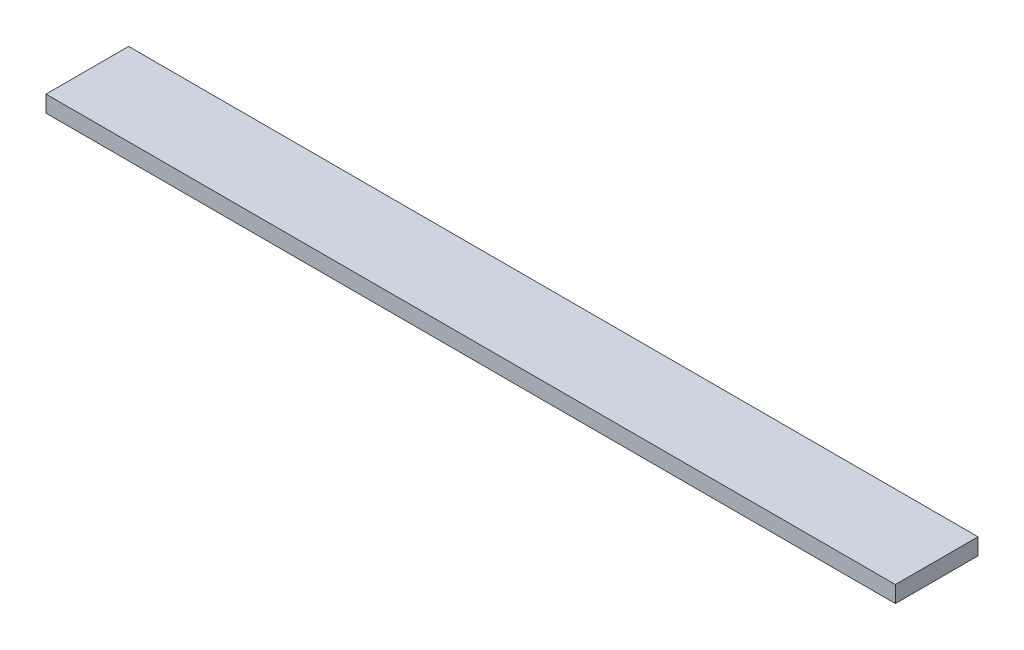
ISO-10303-21;
HEADER;
FILE_DESCRIPTION(('STEP AP214'),'2;1');
FILE_NAME('part.step','',(''),(''),'','','');
FILE_SCHEMA(('AUTOMOTIVE_DESIGN { 1 0 10303 214 1 1 1 1 }'));
ENDSEC;
DATA;
#1=APPLICATION_CONTEXT('core data for automotive mechanical design processes');
#2=APPLICATION_PROTOCOL_DEFINITION('international standard','automotive_design',2000,#1);
#3=PRODUCT_CONTEXT('',#1,'mechanical');
#4=PRODUCT('Part','Part','',(#3));
#5=PRODUCT_RELATED_PRODUCT_CATEGORY('part','',(#4));
#6=PRODUCT_DEFINITION_FORMATION('','',#4);
#7=PRODUCT_DEFINITION_CONTEXT('part definition',#1,'design');
#8=PRODUCT_DEFINITION('design','',#6,#7);
#9=PRODUCT_DEFINITION_SHAPE('','',#8);
#10=(LENGTH_UNIT() NAMED_UNIT(*) SI_UNIT(.MILLI.,.METRE.));
#11=(NAMED_UNIT(*) PLANE_ANGLE_UNIT() SI_UNIT($,.RADIAN.));
#12=(NAMED_UNIT(*) SI_UNIT($,.STERADIAN.) SOLID_ANGLE_UNIT());
#13=UNCERTAINTY_MEASURE_WITH_UNIT(LENGTH_MEASURE(1.E-05),#10,'distance_accuracy_value','');
#14=(GEOMETRIC_REPRESENTATION_CONTEXT(3) GLOBAL_UNCERTAINTY_ASSIGNED_CONTEXT((#13)) GLOBAL_UNIT_ASSIGNED_CONTEXT((#10,
#11,#12)) REPRESENTATION_CONTEXT('',''));
#15=CARTESIAN_POINT('',(0.,0.,0.));
#16=DIRECTION('',(0.,0.,1.));
#17=DIRECTION('',(1.,0.,0.));
#18=AXIS2_PLACEMENT_3D('',#15,#16,#17);
#19=CARTESIAN_POINT('',(-128.5,5.,12.5));
#20=DIRECTION('',(1.,0.,0.));
#21=DIRECTION('',(0.,0.,-1.));
#22=AXIS2_PLACEMENT_3D('',#19,#20,#21);
#23=PLANE('',#22);
#24=DIRECTION('',(0.,0.,1.));
#25=VECTOR('',#24,1.);
#26=CARTESIAN_POINT('',(-128.5,0.,12.5));
#27=LINE('',#26,#25);
#28=CARTESIAN_POINT('',(-128.5,0.,-12.5));
#29=VERTEX_POINT('',#28);
#30=CARTESIAN_POINT('',(-128.5,0.,12.5));
#31=VERTEX_POINT('',#30);
#32=EDGE_CURVE('E99',#29,#31,#27,.T.);
#33=ORIENTED_EDGE('',*,*,#32,.T.);
#34=DIRECTION('',(0.,-1.,0.));
#35=VECTOR('',#34,1.);
#36=CARTESIAN_POINT('',(-128.5,5.,12.5));
#37=LINE('',#36,#35);
#38=CARTESIAN_POINT('',(-128.5,5.,12.5));
#39=VERTEX_POINT('',#38);
#40=EDGE_CURVE('E11',#39,#31,#37,.T.);
#41=ORIENTED_EDGE('',*,*,#40,.F.);
#42=DIRECTION('',(0.,0.,1.));
#43=VECTOR('',#42,1.);
#44=CARTESIAN_POINT('',(-128.5,5.,12.5));
#45=LINE('',#44,#43);
#46=CARTESIAN_POINT('',(-128.5,5.,-12.5));
#47=VERTEX_POINT('',#46);
#48=EDGE_CURVE('E87',#47,#39,#45,.T.);
#49=ORIENTED_EDGE('',*,*,#48,.F.);
#50=DIRECTION('',(0.,-1.,0.));
#51=VECTOR('',#50,1.);
#52=CARTESIAN_POINT('',(-128.5,5.,-12.5));
#53=LINE('',#52,#51);
#54=EDGE_CURVE('E95',#47,#29,#53,.T.);
#55=ORIENTED_EDGE('',*,*,#54,.T.);
#56=EDGE_LOOP('',(#33,#41,#49,#55));
#57=FACE_BOUND('',#56,.T.);
#58=ADVANCED_FACE('F36',(#57),#23,.F.);
#59=CARTESIAN_POINT('',(128.5,5.,12.5));
#60=DIRECTION('',(0.,0.,-1.));
#61=DIRECTION('',(-1.,0.,0.));
#62=AXIS2_PLACEMENT_3D('',#59,#60,#61);
#63=PLANE('',#62);
#64=DIRECTION('',(1.,0.,0.));
#65=VECTOR('',#64,1.);
#66=CARTESIAN_POINT('',(128.5,0.,12.5));
#67=LINE('',#66,#65);
#68=CARTESIAN_POINT('',(128.5,0.,12.5));
#69=VERTEX_POINT('',#68);
#70=EDGE_CURVE('E91',#31,#69,#67,.T.);
#71=ORIENTED_EDGE('',*,*,#70,.T.);
#72=DIRECTION('',(0.,-1.,0.));
#73=VECTOR('',#72,1.);
#74=CARTESIAN_POINT('',(128.5,5.,12.5));
#75=LINE('',#74,#73);
#76=CARTESIAN_POINT('',(128.5,5.,12.5));
#77=VERTEX_POINT('',#76);
#78=EDGE_CURVE('E44',#77,#69,#75,.T.);
#79=ORIENTED_EDGE('',*,*,#78,.F.);
#80=DIRECTION('',(1.,0.,0.));
#81=VECTOR('',#80,1.);
#82=CARTESIAN_POINT('',(128.5,5.,12.5));
#83=LINE('',#82,#81);
#84=EDGE_CURVE('E82',#39,#77,#83,.T.);
#85=ORIENTED_EDGE('',*,*,#84,.F.);
#86=ORIENTED_EDGE('',*,*,#40,.T.);
#87=EDGE_LOOP('',(#71,#79,#85,#86));
#88=FACE_BOUND('',#87,.T.);
#89=ADVANCED_FACE('F90',(#88),#63,.F.);
#90=CARTESIAN_POINT('',(128.5,5.,12.5));
#91=DIRECTION('',(-1.,0.,0.));
#92=DIRECTION('',(0.,0.,1.));
#93=AXIS2_PLACEMENT_3D('',#90,#91,#92);
#94=PLANE('',#93);
#95=DIRECTION('',(0.,0.,-1.));
#96=VECTOR('',#95,1.);
#97=CARTESIAN_POINT('',(128.5,0.,12.5));
#98=LINE('',#97,#96);
#99=CARTESIAN_POINT('',(128.5,0.,-12.5));
#100=VERTEX_POINT('',#99);
#101=EDGE_CURVE('E69',#69,#100,#98,.T.);
#102=ORIENTED_EDGE('',*,*,#101,.T.);
#103=DIRECTION('',(0.,-1.,0.));
#104=VECTOR('',#103,1.);
#105=CARTESIAN_POINT('',(128.5,5.,-12.5));
#106=LINE('',#105,#104);
#107=CARTESIAN_POINT('',(128.5,5.,-12.5));
#108=VERTEX_POINT('',#107);
#109=EDGE_CURVE('E92',#108,#100,#106,.T.);
#110=ORIENTED_EDGE('',*,*,#109,.F.);
#111=DIRECTION('',(0.,0.,-1.));
#112=VECTOR('',#111,1.);
#113=CARTESIAN_POINT('',(128.5,5.,12.5));
#114=LINE('',#113,#112);
#115=EDGE_CURVE('E85',#77,#108,#114,.T.);
#116=ORIENTED_EDGE('',*,*,#115,.F.);
#117=ORIENTED_EDGE('',*,*,#78,.T.);
#118=EDGE_LOOP('',(#102,#110,#116,#117));
#119=FACE_BOUND('',#118,.T.);
#120=ADVANCED_FACE('F93',(#119),#94,.F.);
#121=CARTESIAN_POINT('',(128.5,5.,-12.5));
#122=DIRECTION('',(0.,0.,1.));
#123=DIRECTION('',(1.,0.,0.));
#124=AXIS2_PLACEMENT_3D('',#121,#122,#123);
#125=PLANE('',#124);
#126=DIRECTION('',(-1.,0.,0.));
#127=VECTOR('',#126,1.);
#128=CARTESIAN_POINT('',(128.5,0.,-12.5));
#129=LINE('',#128,#127);
#130=EDGE_CURVE('E75',#100,#29,#129,.T.);
#131=ORIENTED_EDGE('',*,*,#130,.T.);
#132=ORIENTED_EDGE('',*,*,#54,.F.);
#133=DIRECTION('',(-1.,0.,0.));
#134=VECTOR('',#133,1.);
#135=CARTESIAN_POINT('',(128.5,5.,-12.5));
#136=LINE('',#135,#134);
#137=EDGE_CURVE('E52',#108,#47,#136,.T.);
#138=ORIENTED_EDGE('',*,*,#137,.F.);
#139=ORIENTED_EDGE('',*,*,#109,.T.);
#140=EDGE_LOOP('',(#131,#132,#138,#139));
#141=FACE_BOUND('',#140,.T.);
#142=ADVANCED_FACE('F106',(#141),#125,.F.);
#143=CARTESIAN_POINT('',(0.,5.,0.));
#144=DIRECTION('',(0.,1.,0.));
#145=DIRECTION('',(0.,0.,1.));
#146=AXIS2_PLACEMENT_3D('',#143,#144,#145);
#147=PLANE('',#146);
#148=ORIENTED_EDGE('',*,*,#48,.T.);
#149=ORIENTED_EDGE('',*,*,#84,.T.);
#150=ORIENTED_EDGE('',*,*,#115,.T.);
#151=ORIENTED_EDGE('',*,*,#137,.T.);
#152=EDGE_LOOP('',(#148,#149,#150,#151));
#153=FACE_BOUND('',#152,.T.);
#154=ADVANCED_FACE('F83',(#153),#147,.T.);
#155=CARTESIAN_POINT('',(0.,0.,0.));
#156=DIRECTION('',(0.,1.,0.));
#157=DIRECTION('',(0.,0.,1.));
#158=AXIS2_PLACEMENT_3D('',#155,#156,#157);
#159=PLANE('',#158);
#160=ORIENTED_EDGE('',*,*,#32,.F.);
#161=ORIENTED_EDGE('',*,*,#130,.F.);
#162=ORIENTED_EDGE('',*,*,#101,.F.);
#163=ORIENTED_EDGE('',*,*,#70,.F.);
#164=EDGE_LOOP('',(#160,#161,#162,#163));
#165=FACE_BOUND('',#164,.T.);
#166=ADVANCED_FACE('F109',(#165),#159,.F.);
#167=CLOSED_SHELL('',(#58,#89,#120,#142,#154,#166));
#168=MANIFOLD_SOLID_BREP('B2',#167);
#169=ADVANCED_BREP_SHAPE_REPRESENTATION('',(#18,#168),#14);
#170=SHAPE_DEFINITION_REPRESENTATION(#9,#169);
ENDSEC;
END-ISO-10303-21;
